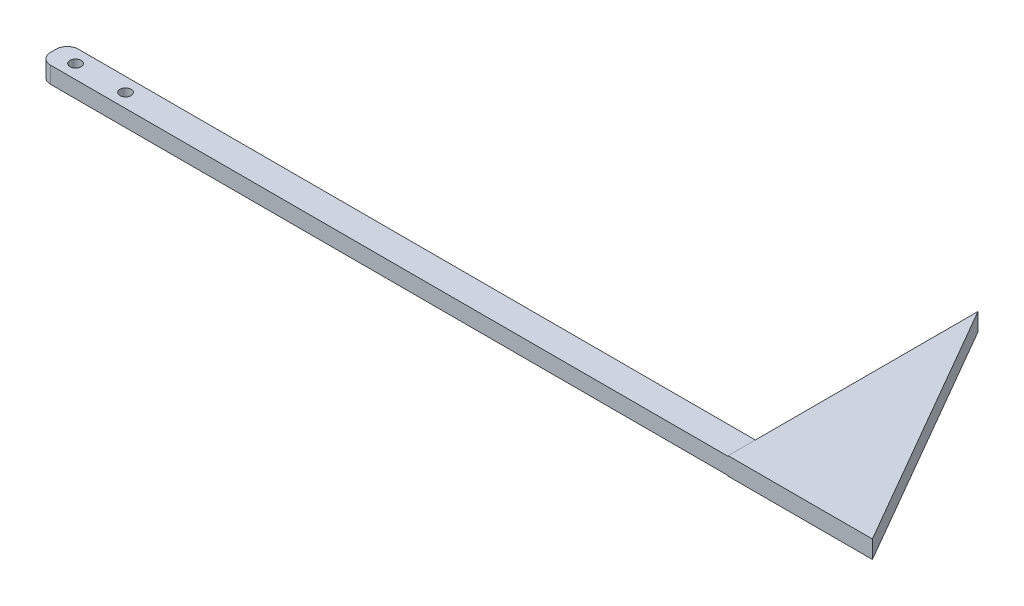
ISO-10303-21;
HEADER;
FILE_DESCRIPTION(('STEP AP214'),'2;1');
FILE_NAME('part.step','',(''),(''),'','','');
FILE_SCHEMA(('AUTOMOTIVE_DESIGN { 1 0 10303 214 1 1 1 1 }'));
ENDSEC;
DATA;
#1=APPLICATION_CONTEXT('core data for automotive mechanical design processes');
#2=APPLICATION_PROTOCOL_DEFINITION('international standard','automotive_design',2000,#1);
#3=PRODUCT_CONTEXT('',#1,'mechanical');
#4=PRODUCT('Part','Part','',(#3));
#5=PRODUCT_RELATED_PRODUCT_CATEGORY('part','',(#4));
#6=PRODUCT_DEFINITION_FORMATION('','',#4);
#7=PRODUCT_DEFINITION_CONTEXT('part definition',#1,'design');
#8=PRODUCT_DEFINITION('design','',#6,#7);
#9=PRODUCT_DEFINITION_SHAPE('','',#8);
#10=(LENGTH_UNIT() NAMED_UNIT(*) SI_UNIT(.MILLI.,.METRE.));
#11=(NAMED_UNIT(*) PLANE_ANGLE_UNIT() SI_UNIT($,.RADIAN.));
#12=(NAMED_UNIT(*) SI_UNIT($,.STERADIAN.) SOLID_ANGLE_UNIT());
#13=UNCERTAINTY_MEASURE_WITH_UNIT(LENGTH_MEASURE(1.E-05),#10,'distance_accuracy_value','');
#14=(GEOMETRIC_REPRESENTATION_CONTEXT(3) GLOBAL_UNCERTAINTY_ASSIGNED_CONTEXT((#13)) GLOBAL_UNIT_ASSIGNED_CONTEXT((#10,
#11,#12)) REPRESENTATION_CONTEXT('',''));
#15=CARTESIAN_POINT('',(0.,0.,0.));
#16=DIRECTION('',(0.,0.,1.));
#17=DIRECTION('',(1.,0.,0.));
#18=AXIS2_PLACEMENT_3D('',#15,#16,#17);
#19=CARTESIAN_POINT('',(0.,0.,0.));
#20=DIRECTION('',(0.,1.,0.));
#21=DIRECTION('',(0.,0.,1.));
#22=AXIS2_PLACEMENT_3D('',#19,#20,#21);
#23=PLANE('',#22);
#24=CARTESIAN_POINT('',(13.,0.,-2.49999999999999));
#25=DIRECTION('',(0.,1.,0.));
#26=DIRECTION('',(0.,0.,1.));
#27=AXIS2_PLACEMENT_3D('',#24,#25,#26);
#28=CIRCLE('',#27,1.);
#29=CARTESIAN_POINT('',(13.,0.,-1.49999999999999));
#30=VERTEX_POINT('',#29);
#31=EDGE_CURVE('E150',#30,#30,#28,.T.);
#32=ORIENTED_EDGE('',*,*,#31,.T.);
#33=EDGE_LOOP('',(#32));
#34=FACE_BOUND('',#33,.T.);
#35=CARTESIAN_POINT('',(4.,0.,-2.49999999999999));
#36=DIRECTION('',(0.,1.,0.));
#37=DIRECTION('',(0.,0.,1.));
#38=AXIS2_PLACEMENT_3D('',#35,#36,#37);
#39=CIRCLE('',#38,1.);
#40=CARTESIAN_POINT('',(4.,0.,-1.49999999999998));
#41=VERTEX_POINT('',#40);
#42=EDGE_CURVE('E154',#41,#41,#39,.T.);
#43=ORIENTED_EDGE('',*,*,#42,.T.);
#44=EDGE_LOOP('',(#43));
#45=FACE_BOUND('',#44,.T.);
#46=DIRECTION('',(0.,0.,-1.));
#47=VECTOR('',#46,1.);
#48=CARTESIAN_POINT('',(124.019237886467,0.,-45.));
#49=LINE('',#48,#47);
#50=CARTESIAN_POINT('',(124.019237886467,0.,0.));
#51=VERTEX_POINT('',#50);
#52=CARTESIAN_POINT('',(124.019237886467,0.,-5.));
#53=VERTEX_POINT('',#52);
#54=EDGE_CURVE('E134',#51,#53,#49,.T.);
#55=ORIENTED_EDGE('',*,*,#54,.F.);
#56=DIRECTION('',(1.,0.,0.));
#57=VECTOR('',#56,1.);
#58=CARTESIAN_POINT('',(0.,0.,0.));
#59=LINE('',#58,#57);
#60=CARTESIAN_POINT('',(2.,0.,0.));
#61=VERTEX_POINT('',#60);
#62=EDGE_CURVE('E171',#61,#51,#59,.T.);
#63=ORIENTED_EDGE('',*,*,#62,.F.);
#64=CARTESIAN_POINT('',(2.,0.,-2.));
#65=DIRECTION('',(0.,1.,0.));
#66=DIRECTION('',(0.,0.,1.));
#67=AXIS2_PLACEMENT_3D('',#64,#65,#66);
#68=CIRCLE('',#67,2.);
#69=CARTESIAN_POINT('',(0.,0.,-2.));
#70=VERTEX_POINT('',#69);
#71=EDGE_CURVE('E183',#61,#70,#68,.F.);
#72=ORIENTED_EDGE('',*,*,#71,.T.);
#73=DIRECTION('',(0.,0.,1.));
#74=VECTOR('',#73,1.);
#75=CARTESIAN_POINT('',(0.,0.,-4.99999999999998));
#76=LINE('',#75,#74);
#77=CARTESIAN_POINT('',(0.,0.,-2.99999999999998));
#78=VERTEX_POINT('',#77);
#79=EDGE_CURVE('E160',#78,#70,#76,.T.);
#80=ORIENTED_EDGE('',*,*,#79,.F.);
#81=CARTESIAN_POINT('',(2.,0.,-2.99999999999998));
#82=DIRECTION('',(0.,1.,0.));
#83=DIRECTION('',(0.,0.,1.));
#84=AXIS2_PLACEMENT_3D('',#81,#82,#83);
#85=CIRCLE('',#84,2.);
#86=CARTESIAN_POINT('',(2.,0.,-4.99999999999998));
#87=VERTEX_POINT('',#86);
#88=EDGE_CURVE('E181',#78,#87,#85,.F.);
#89=ORIENTED_EDGE('',*,*,#88,.T.);
#90=DIRECTION('',(-1.,0.,0.));
#91=VECTOR('',#90,1.);
#92=CARTESIAN_POINT('',(124.019237886467,0.,-5.));
#93=LINE('',#92,#91);
#94=EDGE_CURVE('E166',#53,#87,#93,.T.);
#95=ORIENTED_EDGE('',*,*,#94,.F.);
#96=EDGE_LOOP('',(#55,#63,#72,#80,#89,#95));
#97=FACE_BOUND('',#96,.T.);
#98=ADVANCED_FACE('F37',(#34,#45,#97),#23,.F.);
#99=CARTESIAN_POINT('',(0.,3.,0.));
#100=DIRECTION('',(0.,1.,0.));
#101=DIRECTION('',(0.,0.,1.));
#102=AXIS2_PLACEMENT_3D('',#99,#100,#101);
#103=PLANE('',#102);
#104=DIRECTION('',(0.,0.,1.));
#105=VECTOR('',#104,1.);
#106=CARTESIAN_POINT('',(124.019237886467,3.,-45.));
#107=LINE('',#106,#105);
#108=CARTESIAN_POINT('',(124.019237886467,3.,-5.));
#109=VERTEX_POINT('',#108);
#110=CARTESIAN_POINT('',(124.019237886467,3.,0.));
#111=VERTEX_POINT('',#110);
#112=EDGE_CURVE('E11',#109,#111,#107,.T.);
#113=ORIENTED_EDGE('',*,*,#112,.F.);
#114=DIRECTION('',(-1.,0.,0.));
#115=VECTOR('',#114,1.);
#116=CARTESIAN_POINT('',(124.019237886467,3.,-5.));
#117=LINE('',#116,#115);
#118=CARTESIAN_POINT('',(2.,3.,-4.99999999999998));
#119=VERTEX_POINT('',#118);
#120=EDGE_CURVE('E168',#109,#119,#117,.T.);
#121=ORIENTED_EDGE('',*,*,#120,.T.);
#122=CARTESIAN_POINT('',(2.,3.,-2.99999999999998));
#123=DIRECTION('',(0.,1.,0.));
#124=DIRECTION('',(0.,0.,1.));
#125=AXIS2_PLACEMENT_3D('',#122,#123,#124);
#126=CIRCLE('',#125,2.);
#127=CARTESIAN_POINT('',(0.,3.,-2.99999999999998));
#128=VERTEX_POINT('',#127);
#129=EDGE_CURVE('E189',#119,#128,#126,.T.);
#130=ORIENTED_EDGE('',*,*,#129,.T.);
#131=DIRECTION('',(0.,0.,1.));
#132=VECTOR('',#131,1.);
#133=CARTESIAN_POINT('',(0.,3.,-4.99999999999998));
#134=LINE('',#133,#132);
#135=CARTESIAN_POINT('',(0.,3.,-2.));
#136=VERTEX_POINT('',#135);
#137=EDGE_CURVE('E163',#128,#136,#134,.T.);
#138=ORIENTED_EDGE('',*,*,#137,.T.);
#139=CARTESIAN_POINT('',(2.,3.,-2.));
#140=DIRECTION('',(0.,1.,0.));
#141=DIRECTION('',(0.,0.,1.));
#142=AXIS2_PLACEMENT_3D('',#139,#140,#141);
#143=CIRCLE('',#142,2.);
#144=CARTESIAN_POINT('',(2.,3.,0.));
#145=VERTEX_POINT('',#144);
#146=EDGE_CURVE('E190',#136,#145,#143,.T.);
#147=ORIENTED_EDGE('',*,*,#146,.T.);
#148=DIRECTION('',(1.,0.,0.));
#149=VECTOR('',#148,1.);
#150=CARTESIAN_POINT('',(0.,3.,0.));
#151=LINE('',#150,#149);
#152=EDGE_CURVE('E165',#145,#111,#151,.T.);
#153=ORIENTED_EDGE('',*,*,#152,.T.);
#154=EDGE_LOOP('',(#113,#121,#130,#138,#147,#153));
#155=FACE_BOUND('',#154,.T.);
#156=CARTESIAN_POINT('',(4.,3.,-2.49999999999999));
#157=DIRECTION('',(0.,1.,0.));
#158=DIRECTION('',(0.,0.,1.));
#159=AXIS2_PLACEMENT_3D('',#156,#157,#158);
#160=CIRCLE('',#159,1.);
#161=CARTESIAN_POINT('',(4.,3.,-1.49999999999998));
#162=VERTEX_POINT('',#161);
#163=EDGE_CURVE('E157',#162,#162,#160,.T.);
#164=ORIENTED_EDGE('',*,*,#163,.F.);
#165=EDGE_LOOP('',(#164));
#166=FACE_BOUND('',#165,.T.);
#167=CARTESIAN_POINT('',(13.,3.,-2.49999999999999));
#168=DIRECTION('',(0.,1.,0.));
#169=DIRECTION('',(0.,0.,1.));
#170=AXIS2_PLACEMENT_3D('',#167,#168,#169);
#171=CIRCLE('',#170,1.);
#172=CARTESIAN_POINT('',(13.,3.,-1.49999999999999));
#173=VERTEX_POINT('',#172);
#174=EDGE_CURVE('E151',#173,#173,#171,.T.);
#175=ORIENTED_EDGE('',*,*,#174,.F.);
#176=EDGE_LOOP('',(#175));
#177=FACE_BOUND('',#176,.T.);
#178=ADVANCED_FACE('F194',(#155,#166,#177),#103,.T.);
#179=CARTESIAN_POINT('',(0.,3.,-4.99999999999998));
#180=DIRECTION('',(1.,0.,0.));
#181=DIRECTION('',(0.,0.,-1.));
#182=AXIS2_PLACEMENT_3D('',#179,#180,#181);
#183=PLANE('',#182);
#184=ORIENTED_EDGE('',*,*,#79,.T.);
#185=DIRECTION('',(0.,-1.,0.));
#186=VECTOR('',#185,1.);
#187=CARTESIAN_POINT('',(0.,3.,-2.));
#188=LINE('',#187,#186);
#189=EDGE_CURVE('E60',#70,#136,#188,.F.);
#190=ORIENTED_EDGE('',*,*,#189,.T.);
#191=ORIENTED_EDGE('',*,*,#137,.F.);
#192=DIRECTION('',(0.,-1.,0.));
#193=VECTOR('',#192,1.);
#194=CARTESIAN_POINT('',(0.,3.,-2.99999999999998));
#195=LINE('',#194,#193);
#196=EDGE_CURVE('E185',#128,#78,#195,.T.);
#197=ORIENTED_EDGE('',*,*,#196,.T.);
#198=EDGE_LOOP('',(#184,#190,#191,#197));
#199=FACE_BOUND('',#198,.T.);
#200=ADVANCED_FACE('F206',(#199),#183,.F.);
#201=CARTESIAN_POINT('',(0.,3.,0.));
#202=DIRECTION('',(0.,0.,-1.));
#203=DIRECTION('',(-1.,0.,0.));
#204=AXIS2_PLACEMENT_3D('',#201,#202,#203);
#205=PLANE('',#204);
#206=ORIENTED_EDGE('',*,*,#152,.F.);
#207=DIRECTION('',(0.,-1.,0.));
#208=VECTOR('',#207,1.);
#209=CARTESIAN_POINT('',(2.,3.,0.));
#210=LINE('',#209,#208);
#211=EDGE_CURVE('E178',#145,#61,#210,.T.);
#212=ORIENTED_EDGE('',*,*,#211,.T.);
#213=ORIENTED_EDGE('',*,*,#62,.T.);
#214=DIRECTION('',(0.,1.,0.));
#215=VECTOR('',#214,1.);
#216=CARTESIAN_POINT('',(124.019237886467,-0.1,0.));
#217=LINE('',#216,#215);
#218=CARTESIAN_POINT('',(124.019237886467,-0.1,0.));
#219=VERTEX_POINT('',#218);
#220=EDGE_CURVE('E138',#219,#51,#217,.T.);
#221=ORIENTED_EDGE('',*,*,#220,.F.);
#222=DIRECTION('',(-1.,0.,0.));
#223=VECTOR('',#222,1.);
#224=CARTESIAN_POINT('',(124.019237886467,-0.1,0.));
#225=LINE('',#224,#223);
#226=CARTESIAN_POINT('',(150.,-0.1,0.));
#227=VERTEX_POINT('',#226);
#228=EDGE_CURVE('E130',#227,#219,#225,.T.);
#229=ORIENTED_EDGE('',*,*,#228,.F.);
#230=DIRECTION('',(0.,-1.,0.));
#231=VECTOR('',#230,1.);
#232=CARTESIAN_POINT('',(150.,3.,0.));
#233=LINE('',#232,#231);
#234=CARTESIAN_POINT('',(150.,3.1,0.));
#235=VERTEX_POINT('',#234);
#236=EDGE_CURVE('E122',#235,#227,#233,.T.);
#237=ORIENTED_EDGE('',*,*,#236,.F.);
#238=DIRECTION('',(1.,0.,0.));
#239=VECTOR('',#238,1.);
#240=CARTESIAN_POINT('',(124.019237886467,3.1,0.));
#241=LINE('',#240,#239);
#242=CARTESIAN_POINT('',(124.019237886467,3.1,0.));
#243=VERTEX_POINT('',#242);
#244=EDGE_CURVE('E141',#243,#235,#241,.T.);
#245=ORIENTED_EDGE('',*,*,#244,.F.);
#246=DIRECTION('',(0.,-1.,0.));
#247=VECTOR('',#246,1.);
#248=CARTESIAN_POINT('',(124.019237886467,3.1,0.));
#249=LINE('',#248,#247);
#250=EDGE_CURVE('E146',#243,#111,#249,.T.);
#251=ORIENTED_EDGE('',*,*,#250,.T.);
#252=EDGE_LOOP('',(#206,#212,#213,#221,#229,#237,#245,#251));
#253=FACE_BOUND('',#252,.T.);
#254=ADVANCED_FACE('F199',(#253),#205,.F.);
#255=CARTESIAN_POINT('',(124.019237886467,3.,-45.));
#256=DIRECTION('',(-0.86602540378444,0.,0.499999999999998));
#257=DIRECTION('',(0.499999999999998,0.,0.86602540378444));
#258=AXIS2_PLACEMENT_3D('',#255,#256,#257);
#259=PLANE('',#258);
#260=ORIENTED_EDGE('',*,*,#236,.T.);
#261=DIRECTION('',(0.499999999999998,0.,0.86602540378444));
#262=VECTOR('',#261,1.);
#263=CARTESIAN_POINT('',(124.019237886467,-0.1,-45.));
#264=LINE('',#263,#262);
#265=CARTESIAN_POINT('',(124.019237886467,-0.1,-45.));
#266=VERTEX_POINT('',#265);
#267=EDGE_CURVE('E126',#266,#227,#264,.T.);
#268=ORIENTED_EDGE('',*,*,#267,.F.);
#269=DIRECTION('',(0.,-1.,0.));
#270=VECTOR('',#269,1.);
#271=CARTESIAN_POINT('',(124.019237886467,3.,-45.));
#272=LINE('',#271,#270);
#273=CARTESIAN_POINT('',(124.019237886467,3.1,-45.));
#274=VERTEX_POINT('',#273);
#275=EDGE_CURVE('E112',#274,#266,#272,.T.);
#276=ORIENTED_EDGE('',*,*,#275,.F.);
#277=DIRECTION('',(-0.499999999999998,0.,-0.86602540378444));
#278=VECTOR('',#277,1.);
#279=CARTESIAN_POINT('',(150.,3.1,0.));
#280=LINE('',#279,#278);
#281=EDGE_CURVE('E144',#235,#274,#280,.T.);
#282=ORIENTED_EDGE('',*,*,#281,.F.);
#283=EDGE_LOOP('',(#260,#268,#276,#282));
#284=FACE_BOUND('',#283,.T.);
#285=ADVANCED_FACE('F127',(#284),#259,.F.);
#286=CARTESIAN_POINT('',(124.019237886467,3.,-5.));
#287=DIRECTION('',(1.,0.,0.));
#288=DIRECTION('',(0.,0.,-1.));
#289=AXIS2_PLACEMENT_3D('',#286,#287,#288);
#290=PLANE('',#289);
#291=ORIENTED_EDGE('',*,*,#275,.T.);
#292=DIRECTION('',(0.,0.,-1.));
#293=VECTOR('',#292,1.);
#294=CARTESIAN_POINT('',(124.019237886467,-0.1,-45.));
#295=LINE('',#294,#293);
#296=EDGE_CURVE('E116',#219,#266,#295,.T.);
#297=ORIENTED_EDGE('',*,*,#296,.F.);
#298=ORIENTED_EDGE('',*,*,#220,.T.);
#299=ORIENTED_EDGE('',*,*,#54,.T.);
#300=DIRECTION('',(0.,-1.,0.));
#301=VECTOR('',#300,1.);
#302=CARTESIAN_POINT('',(124.019237886467,3.,-5.));
#303=LINE('',#302,#301);
#304=EDGE_CURVE('E123',#109,#53,#303,.T.);
#305=ORIENTED_EDGE('',*,*,#304,.F.);
#306=ORIENTED_EDGE('',*,*,#112,.T.);
#307=ORIENTED_EDGE('',*,*,#250,.F.);
#308=DIRECTION('',(0.,0.,1.));
#309=VECTOR('',#308,1.);
#310=CARTESIAN_POINT('',(124.019237886467,3.1,-45.));
#311=LINE('',#310,#309);
#312=EDGE_CURVE('E118',#274,#243,#311,.T.);
#313=ORIENTED_EDGE('',*,*,#312,.F.);
#314=EDGE_LOOP('',(#291,#297,#298,#299,#305,#306,#307,#313));
#315=FACE_BOUND('',#314,.T.);
#316=ADVANCED_FACE('F114',(#315),#290,.F.);
#317=CARTESIAN_POINT('',(124.019237886467,3.,-5.));
#318=DIRECTION('',(0.,0.,1.));
#319=DIRECTION('',(1.,0.,0.));
#320=AXIS2_PLACEMENT_3D('',#317,#318,#319);
#321=PLANE('',#320);
#322=ORIENTED_EDGE('',*,*,#94,.T.);
#323=DIRECTION('',(0.,-1.,0.));
#324=VECTOR('',#323,1.);
#325=CARTESIAN_POINT('',(2.,3.,-4.99999999999998));
#326=LINE('',#325,#324);
#327=EDGE_CURVE('E41',#87,#119,#326,.F.);
#328=ORIENTED_EDGE('',*,*,#327,.T.);
#329=ORIENTED_EDGE('',*,*,#120,.F.);
#330=ORIENTED_EDGE('',*,*,#304,.T.);
#331=EDGE_LOOP('',(#322,#328,#329,#330));
#332=FACE_BOUND('',#331,.T.);
#333=ADVANCED_FACE('F211',(#332),#321,.F.);
#334=CARTESIAN_POINT('',(4.,3.,-2.49999999999999));
#335=DIRECTION('',(0.,-1.,0.));
#336=DIRECTION('',(0.,0.,-1.));
#337=AXIS2_PLACEMENT_3D('',#334,#335,#336);
#338=CYLINDRICAL_SURFACE('',#337,1.);
#339=ORIENTED_EDGE('',*,*,#163,.T.);
#340=EDGE_LOOP('',(#339));
#341=FACE_BOUND('',#340,.T.);
#342=ORIENTED_EDGE('',*,*,#42,.F.);
#343=EDGE_LOOP('',(#342));
#344=FACE_BOUND('',#343,.T.);
#345=ADVANCED_FACE('F237',(#341,#344),#338,.F.);
#346=CARTESIAN_POINT('',(13.,3.,-2.49999999999999));
#347=DIRECTION('',(0.,-1.,0.));
#348=DIRECTION('',(0.,0.,-1.));
#349=AXIS2_PLACEMENT_3D('',#346,#347,#348);
#350=CYLINDRICAL_SURFACE('',#349,1.);
#351=ORIENTED_EDGE('',*,*,#174,.T.);
#352=EDGE_LOOP('',(#351));
#353=FACE_BOUND('',#352,.T.);
#354=ORIENTED_EDGE('',*,*,#31,.F.);
#355=EDGE_LOOP('',(#354));
#356=FACE_BOUND('',#355,.T.);
#357=ADVANCED_FACE('F245',(#353,#356),#350,.F.);
#358=CARTESIAN_POINT('',(2.,3.,-2.));
#359=DIRECTION('',(0.,-1.,0.));
#360=DIRECTION('',(0.,0.,-1.));
#361=AXIS2_PLACEMENT_3D('',#358,#359,#360);
#362=CYLINDRICAL_SURFACE('',#361,2.);
#363=ORIENTED_EDGE('',*,*,#146,.F.);
#364=ORIENTED_EDGE('',*,*,#189,.F.);
#365=ORIENTED_EDGE('',*,*,#71,.F.);
#366=ORIENTED_EDGE('',*,*,#211,.F.);
#367=EDGE_LOOP('',(#363,#364,#365,#366));
#368=FACE_BOUND('',#367,.T.);
#369=ADVANCED_FACE('F202',(#368),#362,.T.);
#370=CARTESIAN_POINT('',(2.,3.,-2.99999999999998));
#371=DIRECTION('',(0.,-1.,0.));
#372=DIRECTION('',(0.,0.,-1.));
#373=AXIS2_PLACEMENT_3D('',#370,#371,#372);
#374=CYLINDRICAL_SURFACE('',#373,2.);
#375=ORIENTED_EDGE('',*,*,#129,.F.);
#376=ORIENTED_EDGE('',*,*,#327,.F.);
#377=ORIENTED_EDGE('',*,*,#88,.F.);
#378=ORIENTED_EDGE('',*,*,#196,.F.);
#379=EDGE_LOOP('',(#375,#376,#377,#378));
#380=FACE_BOUND('',#379,.T.);
#381=ADVANCED_FACE('F39',(#380),#374,.T.);
#382=CARTESIAN_POINT('',(0.,3.1,0.));
#383=DIRECTION('',(0.,-1.,0.));
#384=DIRECTION('',(0.,0.,-1.));
#385=AXIS2_PLACEMENT_3D('',#382,#383,#384);
#386=PLANE('',#385);
#387=ORIENTED_EDGE('',*,*,#244,.T.);
#388=ORIENTED_EDGE('',*,*,#281,.T.);
#389=ORIENTED_EDGE('',*,*,#312,.T.);
#390=EDGE_LOOP('',(#387,#388,#389));
#391=FACE_BOUND('',#390,.T.);
#392=ADVANCED_FACE('F214',(#391),#386,.F.);
#393=CARTESIAN_POINT('',(0.,-0.1,0.));
#394=DIRECTION('',(0.,1.,0.));
#395=DIRECTION('',(0.,0.,1.));
#396=AXIS2_PLACEMENT_3D('',#393,#394,#395);
#397=PLANE('',#396);
#398=ORIENTED_EDGE('',*,*,#296,.T.);
#399=ORIENTED_EDGE('',*,*,#267,.T.);
#400=ORIENTED_EDGE('',*,*,#228,.T.);
#401=EDGE_LOOP('',(#398,#399,#400));
#402=FACE_BOUND('',#401,.T.);
#403=ADVANCED_FACE('F132',(#402),#397,.F.);
#404=CLOSED_SHELL('',(#98,#178,#200,#254,#285,#316,#333,#345,#357,#369,#381,#392,#403));
#405=MANIFOLD_SOLID_BREP('B2',#404);
#406=ADVANCED_BREP_SHAPE_REPRESENTATION('',(#18,#405),#14);
#407=SHAPE_DEFINITION_REPRESENTATION(#9,#406);
ENDSEC;
END-ISO-10303-21;
